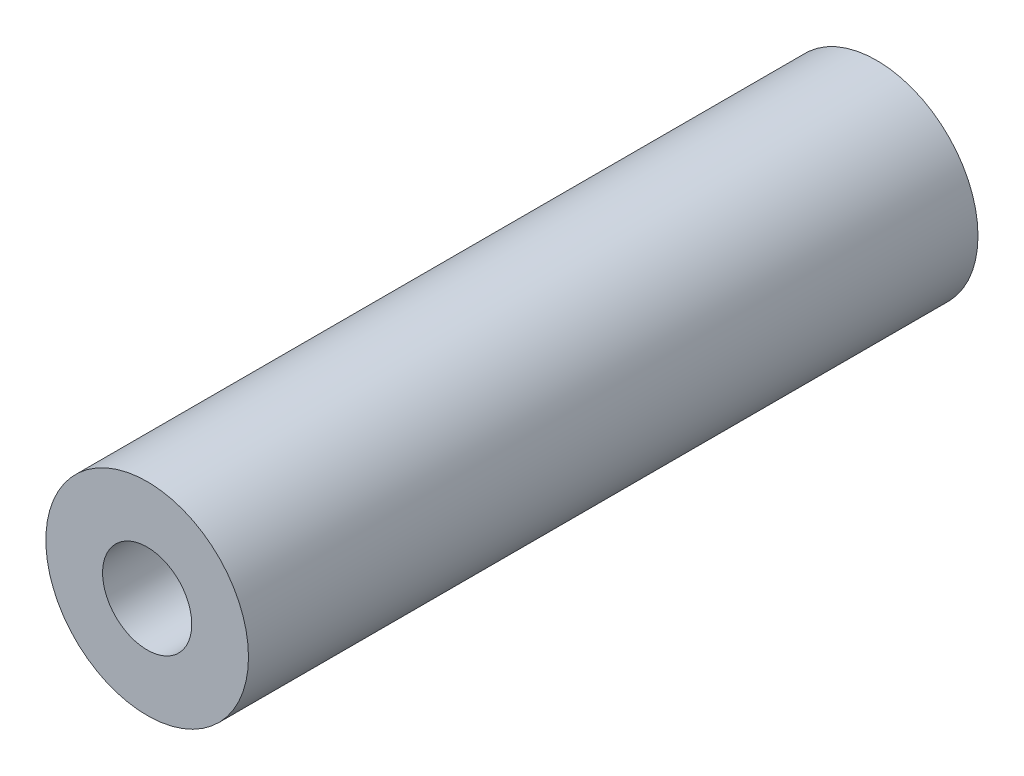
ISO-10303-21;
HEADER;
FILE_DESCRIPTION(('STEP AP214'),'2;1');
FILE_NAME('part.step','',(''),(''),'','','');
FILE_SCHEMA(('AUTOMOTIVE_DESIGN { 1 0 10303 214 1 1 1 1 }'));
ENDSEC;
DATA;
#1=APPLICATION_CONTEXT('core data for automotive mechanical design processes');
#2=APPLICATION_PROTOCOL_DEFINITION('international standard','automotive_design',2000,#1);
#3=PRODUCT_CONTEXT('',#1,'mechanical');
#4=PRODUCT('Part','Part','',(#3));
#5=PRODUCT_RELATED_PRODUCT_CATEGORY('part','',(#4));
#6=PRODUCT_DEFINITION_FORMATION('','',#4);
#7=PRODUCT_DEFINITION_CONTEXT('part definition',#1,'design');
#8=PRODUCT_DEFINITION('design','',#6,#7);
#9=PRODUCT_DEFINITION_SHAPE('','',#8);
#10=(LENGTH_UNIT() NAMED_UNIT(*) SI_UNIT(.MILLI.,.METRE.));
#11=(NAMED_UNIT(*) PLANE_ANGLE_UNIT() SI_UNIT($,.RADIAN.));
#12=(NAMED_UNIT(*) SI_UNIT($,.STERADIAN.) SOLID_ANGLE_UNIT());
#13=UNCERTAINTY_MEASURE_WITH_UNIT(LENGTH_MEASURE(1.E-05),#10,'distance_accuracy_value','');
#14=(GEOMETRIC_REPRESENTATION_CONTEXT(3) GLOBAL_UNCERTAINTY_ASSIGNED_CONTEXT((#13)) GLOBAL_UNIT_ASSIGNED_CONTEXT((#10,
#11,#12)) REPRESENTATION_CONTEXT('',''));
#15=CARTESIAN_POINT('',(0.,0.,0.));
#16=DIRECTION('',(0.,0.,1.));
#17=DIRECTION('',(1.,0.,0.));
#18=AXIS2_PLACEMENT_3D('',#15,#16,#17);
#19=CARTESIAN_POINT('',(0.,0.,27.1739659809032));
#20=DIRECTION('',(0.,0.,-1.));
#21=DIRECTION('',(-1.,0.,0.));
#22=AXIS2_PLACEMENT_3D('',#19,#20,#21);
#23=CYLINDRICAL_SURFACE('',#22,3.79875);
#24=CARTESIAN_POINT('',(0.,0.,27.1739659809032));
#25=DIRECTION('',(0.,0.,1.));
#26=DIRECTION('',(1.,0.,0.));
#27=AXIS2_PLACEMENT_3D('',#24,#25,#26);
#28=CIRCLE('',#27,3.79875);
#29=CARTESIAN_POINT('',(3.79875,0.,27.1739659809032));
#30=VERTEX_POINT('',#29);
#31=EDGE_CURVE('E11',#30,#30,#28,.T.);
#32=ORIENTED_EDGE('',*,*,#31,.F.);
#33=EDGE_LOOP('',(#32));
#34=FACE_BOUND('',#33,.T.);
#35=CARTESIAN_POINT('',(0.,0.,-0.177034019096802));
#36=DIRECTION('',(0.,0.,1.));
#37=DIRECTION('',(1.,0.,0.));
#38=AXIS2_PLACEMENT_3D('',#35,#36,#37);
#39=CIRCLE('',#38,3.79875);
#40=CARTESIAN_POINT('',(3.79875,0.,-0.177034019096802));
#41=VERTEX_POINT('',#40);
#42=EDGE_CURVE('E48',#41,#41,#39,.T.);
#43=ORIENTED_EDGE('',*,*,#42,.T.);
#44=EDGE_LOOP('',(#43));
#45=FACE_BOUND('',#44,.T.);
#46=ADVANCED_FACE('F45',(#34,#45),#23,.T.);
#47=CARTESIAN_POINT('',(0.,0.,27.1739659809032));
#48=DIRECTION('',(0.,0.,1.));
#49=DIRECTION('',(1.,0.,0.));
#50=AXIS2_PLACEMENT_3D('',#47,#48,#49);
#51=PLANE('',#50);
#52=CARTESIAN_POINT('',(0.,0.,27.1739659809032));
#53=DIRECTION('',(0.,0.,1.));
#54=DIRECTION('',(1.,0.,0.));
#55=AXIS2_PLACEMENT_3D('',#52,#53,#54);
#56=CIRCLE('',#55,1.67144999999999);
#57=CARTESIAN_POINT('',(1.67144999999999,0.,27.1739659809032));
#58=VERTEX_POINT('',#57);
#59=EDGE_CURVE('E68',#58,#58,#56,.T.);
#60=ORIENTED_EDGE('',*,*,#59,.F.);
#61=EDGE_LOOP('',(#60));
#62=FACE_BOUND('',#61,.T.);
#63=ORIENTED_EDGE('',*,*,#31,.T.);
#64=EDGE_LOOP('',(#63));
#65=FACE_BOUND('',#64,.T.);
#66=ADVANCED_FACE('F87',(#62,#65),#51,.T.);
#67=CARTESIAN_POINT('',(0.,0.,-0.177034019096802));
#68=DIRECTION('',(0.,0.,1.));
#69=DIRECTION('',(1.,0.,0.));
#70=AXIS2_PLACEMENT_3D('',#67,#68,#69);
#71=PLANE('',#70);
#72=CARTESIAN_POINT('',(0.,0.,-0.177034019096804));
#73=DIRECTION('',(0.,0.,-1.));
#74=DIRECTION('',(-1.,0.,0.));
#75=AXIS2_PLACEMENT_3D('',#72,#73,#74);
#76=CIRCLE('',#75,1.67144999999999);
#77=CARTESIAN_POINT('',(-1.67144999999999,0.,-0.177034019096804));
#78=VERTEX_POINT('',#77);
#79=EDGE_CURVE('E69',#78,#78,#76,.T.);
#80=ORIENTED_EDGE('',*,*,#79,.F.);
#81=EDGE_LOOP('',(#80));
#82=FACE_BOUND('',#81,.T.);
#83=ORIENTED_EDGE('',*,*,#42,.F.);
#84=EDGE_LOOP('',(#83));
#85=FACE_BOUND('',#84,.T.);
#86=ADVANCED_FACE('F84',(#82,#85),#71,.F.);
#87=CARTESIAN_POINT('',(0.,0.,22.1089659809032));
#88=DIRECTION('',(0.,0.,1.));
#89=DIRECTION('',(1.,0.,0.));
#90=AXIS2_PLACEMENT_3D('',#87,#88,#89);
#91=CONICAL_SURFACE('',#90,1.67144999999999,1.02974425867665);
#92=CARTESIAN_POINT('',(0.,0.,21.1046574992296));
#93=VERTEX_POINT('',#92);
#94=VERTEX_LOOP('',#93);
#95=FACE_BOUND('',#94,.T.);
#96=CARTESIAN_POINT('',(0.,0.,22.1089659809032));
#97=DIRECTION('',(0.,0.,1.));
#98=DIRECTION('',(1.,0.,0.));
#99=AXIS2_PLACEMENT_3D('',#96,#97,#98);
#100=CIRCLE('',#99,1.67144999999999);
#101=CARTESIAN_POINT('',(1.67144999999999,0.,22.1089659809032));
#102=VERTEX_POINT('',#101);
#103=EDGE_CURVE('E72',#102,#102,#100,.T.);
#104=ORIENTED_EDGE('',*,*,#103,.T.);
#105=EDGE_LOOP('',(#104));
#106=FACE_BOUND('',#105,.T.);
#107=ADVANCED_FACE('F86',(#95,#106),#91,.F.);
#108=CARTESIAN_POINT('',(0.,0.,27.1739659809032));
#109=DIRECTION('',(0.,0.,1.));
#110=DIRECTION('',(1.,0.,0.));
#111=AXIS2_PLACEMENT_3D('',#108,#109,#110);
#112=CYLINDRICAL_SURFACE('',#111,1.67144999999999);
#113=ORIENTED_EDGE('',*,*,#103,.F.);
#114=EDGE_LOOP('',(#113));
#115=FACE_BOUND('',#114,.T.);
#116=ORIENTED_EDGE('',*,*,#59,.T.);
#117=EDGE_LOOP('',(#116));
#118=FACE_BOUND('',#117,.T.);
#119=ADVANCED_FACE('F62',(#115,#118),#112,.F.);
#120=CARTESIAN_POINT('',(0.,0.,7.0152659809032));
#121=DIRECTION('',(0.,0.,-1.));
#122=DIRECTION('',(-1.,0.,0.));
#123=AXIS2_PLACEMENT_3D('',#120,#121,#122);
#124=CONICAL_SURFACE('',#123,1.67145,1.02974425867665);
#125=CARTESIAN_POINT('',(0.,0.,8.01957446257681));
#126=VERTEX_POINT('',#125);
#127=VERTEX_LOOP('',#126);
#128=FACE_BOUND('',#127,.T.);
#129=CARTESIAN_POINT('',(0.,0.,7.0152659809032));
#130=DIRECTION('',(0.,0.,-1.));
#131=DIRECTION('',(-1.,0.,0.));
#132=AXIS2_PLACEMENT_3D('',#129,#130,#131);
#133=CIRCLE('',#132,1.67145);
#134=CARTESIAN_POINT('',(-1.67145,0.,7.0152659809032));
#135=VERTEX_POINT('',#134);
#136=EDGE_CURVE('E66',#135,#135,#133,.T.);
#137=ORIENTED_EDGE('',*,*,#136,.T.);
#138=EDGE_LOOP('',(#137));
#139=FACE_BOUND('',#138,.T.);
#140=ADVANCED_FACE('F58',(#128,#139),#124,.F.);
#141=CARTESIAN_POINT('',(0.,0.,-0.177034019096802));
#142=DIRECTION('',(0.,0.,-1.));
#143=DIRECTION('',(-1.,0.,0.));
#144=AXIS2_PLACEMENT_3D('',#141,#142,#143);
#145=CYLINDRICAL_SURFACE('',#144,1.67144999999999);
#146=ORIENTED_EDGE('',*,*,#136,.F.);
#147=EDGE_LOOP('',(#146));
#148=FACE_BOUND('',#147,.T.);
#149=ORIENTED_EDGE('',*,*,#79,.T.);
#150=EDGE_LOOP('',(#149));
#151=FACE_BOUND('',#150,.T.);
#152=ADVANCED_FACE('F61',(#148,#151),#145,.F.);
#153=CLOSED_SHELL('',(#46,#66,#86,#107,#119,#140,#152));
#154=MANIFOLD_SOLID_BREP('B2',#153);
#155=ADVANCED_BREP_SHAPE_REPRESENTATION('',(#18,#154),#14);
#156=SHAPE_DEFINITION_REPRESENTATION(#9,#155);
ENDSEC;
END-ISO-10303-21;
